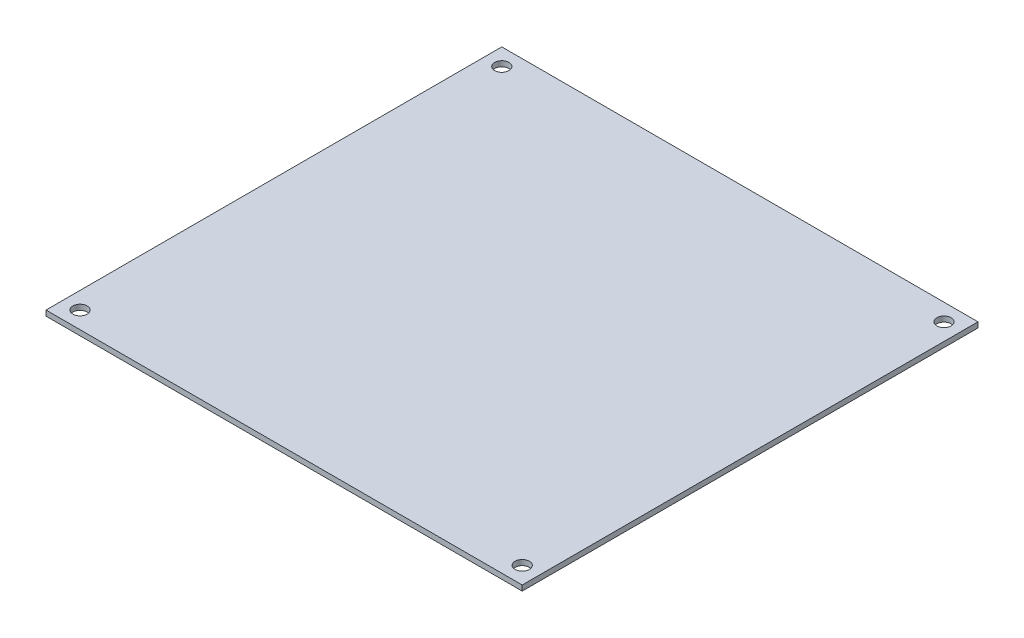
ISO-10303-21;
HEADER;
FILE_DESCRIPTION(('STEP AP214'),'2;1');
FILE_NAME('part.step','',(''),(''),'','','');
FILE_SCHEMA(('AUTOMOTIVE_DESIGN { 1 0 10303 214 1 1 1 1 }'));
ENDSEC;
DATA;
#1=APPLICATION_CONTEXT('core data for automotive mechanical design processes');
#2=APPLICATION_PROTOCOL_DEFINITION('international standard','automotive_design',2000,#1);
#3=PRODUCT_CONTEXT('',#1,'mechanical');
#4=PRODUCT('Part','Part','',(#3));
#5=PRODUCT_RELATED_PRODUCT_CATEGORY('part','',(#4));
#6=PRODUCT_DEFINITION_FORMATION('','',#4);
#7=PRODUCT_DEFINITION_CONTEXT('part definition',#1,'design');
#8=PRODUCT_DEFINITION('design','',#6,#7);
#9=PRODUCT_DEFINITION_SHAPE('','',#8);
#10=(LENGTH_UNIT() NAMED_UNIT(*) SI_UNIT(.MILLI.,.METRE.));
#11=(NAMED_UNIT(*) PLANE_ANGLE_UNIT() SI_UNIT($,.RADIAN.));
#12=(NAMED_UNIT(*) SI_UNIT($,.STERADIAN.) SOLID_ANGLE_UNIT());
#13=UNCERTAINTY_MEASURE_WITH_UNIT(LENGTH_MEASURE(1.E-05),#10,'distance_accuracy_value','');
#14=(GEOMETRIC_REPRESENTATION_CONTEXT(3) GLOBAL_UNCERTAINTY_ASSIGNED_CONTEXT((#13)) GLOBAL_UNIT_ASSIGNED_CONTEXT((#10,
#11,#12)) REPRESENTATION_CONTEXT('',''));
#15=CARTESIAN_POINT('',(0.,0.,0.));
#16=DIRECTION('',(0.,0.,1.));
#17=DIRECTION('',(1.,0.,0.));
#18=AXIS2_PLACEMENT_3D('',#15,#16,#17);
#19=CARTESIAN_POINT('',(0.,1.57,0.));
#20=DIRECTION('',(0.,-1.,0.));
#21=DIRECTION('',(0.,0.,-1.));
#22=AXIS2_PLACEMENT_3D('',#19,#20,#21);
#23=PLANE('',#22);
#24=DIRECTION('',(0.,0.,1.));
#25=VECTOR('',#24,1.);
#26=CARTESIAN_POINT('',(0.,1.57,0.));
#27=LINE('',#26,#25);
#28=CARTESIAN_POINT('',(0.,1.57,-134.));
#29=VERTEX_POINT('',#28);
#30=CARTESIAN_POINT('',(0.,1.57,0.));
#31=VERTEX_POINT('',#30);
#32=EDGE_CURVE('E85',#29,#31,#27,.T.);
#33=ORIENTED_EDGE('',*,*,#32,.T.);
#34=DIRECTION('',(1.,0.,0.));
#35=VECTOR('',#34,1.);
#36=CARTESIAN_POINT('',(0.,1.57,0.));
#37=LINE('',#36,#35);
#38=CARTESIAN_POINT('',(140.,1.57,0.));
#39=VERTEX_POINT('',#38);
#40=EDGE_CURVE('E80',#31,#39,#37,.T.);
#41=ORIENTED_EDGE('',*,*,#40,.T.);
#42=DIRECTION('',(0.,0.,-1.));
#43=VECTOR('',#42,1.);
#44=CARTESIAN_POINT('',(140.,1.57,0.));
#45=LINE('',#44,#43);
#46=CARTESIAN_POINT('',(140.,1.57,-134.));
#47=VERTEX_POINT('',#46);
#48=EDGE_CURVE('E83',#39,#47,#45,.T.);
#49=ORIENTED_EDGE('',*,*,#48,.T.);
#50=DIRECTION('',(-1.,0.,0.));
#51=VECTOR('',#50,1.);
#52=CARTESIAN_POINT('',(0.,1.57,-134.));
#53=LINE('',#52,#51);
#54=EDGE_CURVE('E50',#47,#29,#53,.T.);
#55=ORIENTED_EDGE('',*,*,#54,.T.);
#56=EDGE_LOOP('',(#33,#41,#49,#55));
#57=FACE_BOUND('',#56,.T.);
#58=CARTESIAN_POINT('',(5.00000000000002,1.57,-129.));
#59=DIRECTION('',(0.,1.,0.));
#60=DIRECTION('',(0.,0.,1.));
#61=AXIS2_PLACEMENT_3D('',#58,#59,#60);
#62=CIRCLE('',#61,2.1);
#63=CARTESIAN_POINT('',(5.00000000000002,1.57,-126.9));
#64=VERTEX_POINT('',#63);
#65=EDGE_CURVE('E100',#64,#64,#62,.T.);
#66=ORIENTED_EDGE('',*,*,#65,.F.);
#67=EDGE_LOOP('',(#66));
#68=FACE_BOUND('',#67,.T.);
#69=CARTESIAN_POINT('',(135.,1.57,-129.));
#70=DIRECTION('',(0.,1.,0.));
#71=DIRECTION('',(0.,0.,1.));
#72=AXIS2_PLACEMENT_3D('',#69,#70,#71);
#73=CIRCLE('',#72,2.10000000000002);
#74=CARTESIAN_POINT('',(135.,1.57,-126.9));
#75=VERTEX_POINT('',#74);
#76=EDGE_CURVE('E115',#75,#75,#73,.T.);
#77=ORIENTED_EDGE('',*,*,#76,.F.);
#78=EDGE_LOOP('',(#77));
#79=FACE_BOUND('',#78,.T.);
#80=CARTESIAN_POINT('',(135.,1.57,-5.));
#81=DIRECTION('',(0.,1.,0.));
#82=DIRECTION('',(0.,0.,1.));
#83=AXIS2_PLACEMENT_3D('',#80,#81,#82);
#84=CIRCLE('',#83,2.09999999999999);
#85=CARTESIAN_POINT('',(135.,1.57,-2.90000000000001));
#86=VERTEX_POINT('',#85);
#87=EDGE_CURVE('E121',#86,#86,#84,.T.);
#88=ORIENTED_EDGE('',*,*,#87,.F.);
#89=EDGE_LOOP('',(#88));
#90=FACE_BOUND('',#89,.T.);
#91=CARTESIAN_POINT('',(5.00000000000002,1.57,-4.99999999999999));
#92=DIRECTION('',(0.,1.,0.));
#93=DIRECTION('',(0.,0.,1.));
#94=AXIS2_PLACEMENT_3D('',#91,#92,#93);
#95=CIRCLE('',#94,2.1);
#96=CARTESIAN_POINT('',(5.00000000000002,1.57,-2.89999999999999));
#97=VERTEX_POINT('',#96);
#98=EDGE_CURVE('E127',#97,#97,#95,.T.);
#99=ORIENTED_EDGE('',*,*,#98,.F.);
#100=EDGE_LOOP('',(#99));
#101=FACE_BOUND('',#100,.T.);
#102=ADVANCED_FACE('F33',(#57,#68,#79,#90,#101),#23,.F.);
#103=CARTESIAN_POINT('',(0.,0.,0.));
#104=DIRECTION('',(0.,-1.,0.));
#105=DIRECTION('',(0.,0.,-1.));
#106=AXIS2_PLACEMENT_3D('',#103,#104,#105);
#107=PLANE('',#106);
#108=CARTESIAN_POINT('',(135.,0.,-5.));
#109=DIRECTION('',(0.,1.,0.));
#110=DIRECTION('',(0.,0.,1.));
#111=AXIS2_PLACEMENT_3D('',#108,#109,#110);
#112=CIRCLE('',#111,2.09999999999999);
#113=CARTESIAN_POINT('',(135.,0.,-2.90000000000001));
#114=VERTEX_POINT('',#113);
#115=EDGE_CURVE('E124',#114,#114,#112,.T.);
#116=ORIENTED_EDGE('',*,*,#115,.T.);
#117=EDGE_LOOP('',(#116));
#118=FACE_BOUND('',#117,.T.);
#119=CARTESIAN_POINT('',(5.00000000000002,0.,-129.));
#120=DIRECTION('',(0.,1.,0.));
#121=DIRECTION('',(0.,0.,1.));
#122=AXIS2_PLACEMENT_3D('',#119,#120,#121);
#123=CIRCLE('',#122,2.1);
#124=CARTESIAN_POINT('',(5.00000000000002,0.,-126.9));
#125=VERTEX_POINT('',#124);
#126=EDGE_CURVE('E112',#125,#125,#123,.T.);
#127=ORIENTED_EDGE('',*,*,#126,.T.);
#128=EDGE_LOOP('',(#127));
#129=FACE_BOUND('',#128,.T.);
#130=DIRECTION('',(0.,0.,1.));
#131=VECTOR('',#130,1.);
#132=CARTESIAN_POINT('',(0.,0.,0.));
#133=LINE('',#132,#131);
#134=CARTESIAN_POINT('',(0.,0.,-134.));
#135=VERTEX_POINT('',#134);
#136=CARTESIAN_POINT('',(0.,0.,0.));
#137=VERTEX_POINT('',#136);
#138=EDGE_CURVE('E97',#135,#137,#133,.T.);
#139=ORIENTED_EDGE('',*,*,#138,.F.);
#140=DIRECTION('',(-1.,0.,0.));
#141=VECTOR('',#140,1.);
#142=CARTESIAN_POINT('',(0.,0.,-134.));
#143=LINE('',#142,#141);
#144=CARTESIAN_POINT('',(140.,0.,-134.));
#145=VERTEX_POINT('',#144);
#146=EDGE_CURVE('E73',#145,#135,#143,.T.);
#147=ORIENTED_EDGE('',*,*,#146,.F.);
#148=DIRECTION('',(0.,0.,-1.));
#149=VECTOR('',#148,1.);
#150=CARTESIAN_POINT('',(140.,0.,0.));
#151=LINE('',#150,#149);
#152=CARTESIAN_POINT('',(140.,0.,0.));
#153=VERTEX_POINT('',#152);
#154=EDGE_CURVE('E67',#153,#145,#151,.T.);
#155=ORIENTED_EDGE('',*,*,#154,.F.);
#156=DIRECTION('',(1.,0.,0.));
#157=VECTOR('',#156,1.);
#158=CARTESIAN_POINT('',(0.,0.,0.));
#159=LINE('',#158,#157);
#160=EDGE_CURVE('E89',#137,#153,#159,.T.);
#161=ORIENTED_EDGE('',*,*,#160,.F.);
#162=EDGE_LOOP('',(#139,#147,#155,#161));
#163=FACE_BOUND('',#162,.T.);
#164=CARTESIAN_POINT('',(135.,0.,-129.));
#165=DIRECTION('',(0.,1.,0.));
#166=DIRECTION('',(0.,0.,1.));
#167=AXIS2_PLACEMENT_3D('',#164,#165,#166);
#168=CIRCLE('',#167,2.10000000000002);
#169=CARTESIAN_POINT('',(135.,0.,-126.9));
#170=VERTEX_POINT('',#169);
#171=EDGE_CURVE('E118',#170,#170,#168,.T.);
#172=ORIENTED_EDGE('',*,*,#171,.T.);
#173=EDGE_LOOP('',(#172));
#174=FACE_BOUND('',#173,.T.);
#175=CARTESIAN_POINT('',(5.00000000000002,0.,-4.99999999999999));
#176=DIRECTION('',(0.,1.,0.));
#177=DIRECTION('',(0.,0.,1.));
#178=AXIS2_PLACEMENT_3D('',#175,#176,#177);
#179=CIRCLE('',#178,2.1);
#180=CARTESIAN_POINT('',(5.00000000000002,0.,-2.89999999999999));
#181=VERTEX_POINT('',#180);
#182=EDGE_CURVE('E130',#181,#181,#179,.T.);
#183=ORIENTED_EDGE('',*,*,#182,.T.);
#184=EDGE_LOOP('',(#183));
#185=FACE_BOUND('',#184,.T.);
#186=ADVANCED_FACE('F108',(#118,#129,#163,#174,#185),#107,.T.);
#187=CARTESIAN_POINT('',(0.,1.57,0.));
#188=DIRECTION('',(1.,0.,0.));
#189=DIRECTION('',(0.,0.,-1.));
#190=AXIS2_PLACEMENT_3D('',#187,#188,#189);
#191=PLANE('',#190);
#192=ORIENTED_EDGE('',*,*,#138,.T.);
#193=DIRECTION('',(0.,-1.,0.));
#194=VECTOR('',#193,1.);
#195=CARTESIAN_POINT('',(0.,1.57,0.));
#196=LINE('',#195,#194);
#197=EDGE_CURVE('E11',#31,#137,#196,.T.);
#198=ORIENTED_EDGE('',*,*,#197,.F.);
#199=ORIENTED_EDGE('',*,*,#32,.F.);
#200=DIRECTION('',(0.,-1.,0.));
#201=VECTOR('',#200,1.);
#202=CARTESIAN_POINT('',(0.,1.57,-134.));
#203=LINE('',#202,#201);
#204=EDGE_CURVE('E93',#29,#135,#203,.T.);
#205=ORIENTED_EDGE('',*,*,#204,.T.);
#206=EDGE_LOOP('',(#192,#198,#199,#205));
#207=FACE_BOUND('',#206,.T.);
#208=ADVANCED_FACE('F35',(#207),#191,.F.);
#209=CARTESIAN_POINT('',(0.,1.57,0.));
#210=DIRECTION('',(0.,0.,-1.));
#211=DIRECTION('',(-1.,0.,0.));
#212=AXIS2_PLACEMENT_3D('',#209,#210,#211);
#213=PLANE('',#212);
#214=ORIENTED_EDGE('',*,*,#160,.T.);
#215=DIRECTION('',(0.,-1.,0.));
#216=VECTOR('',#215,1.);
#217=CARTESIAN_POINT('',(140.,1.57,0.));
#218=LINE('',#217,#216);
#219=EDGE_CURVE('E42',#39,#153,#218,.T.);
#220=ORIENTED_EDGE('',*,*,#219,.F.);
#221=ORIENTED_EDGE('',*,*,#40,.F.);
#222=ORIENTED_EDGE('',*,*,#197,.T.);
#223=EDGE_LOOP('',(#214,#220,#221,#222));
#224=FACE_BOUND('',#223,.T.);
#225=ADVANCED_FACE('F88',(#224),#213,.F.);
#226=CARTESIAN_POINT('',(140.,1.57,0.));
#227=DIRECTION('',(-1.,0.,0.));
#228=DIRECTION('',(0.,0.,1.));
#229=AXIS2_PLACEMENT_3D('',#226,#227,#228);
#230=PLANE('',#229);
#231=ORIENTED_EDGE('',*,*,#154,.T.);
#232=DIRECTION('',(0.,-1.,0.));
#233=VECTOR('',#232,1.);
#234=CARTESIAN_POINT('',(140.,1.57,-134.));
#235=LINE('',#234,#233);
#236=EDGE_CURVE('E90',#47,#145,#235,.T.);
#237=ORIENTED_EDGE('',*,*,#236,.F.);
#238=ORIENTED_EDGE('',*,*,#48,.F.);
#239=ORIENTED_EDGE('',*,*,#219,.T.);
#240=EDGE_LOOP('',(#231,#237,#238,#239));
#241=FACE_BOUND('',#240,.T.);
#242=ADVANCED_FACE('F91',(#241),#230,.F.);
#243=CARTESIAN_POINT('',(0.,1.57,-134.));
#244=DIRECTION('',(0.,0.,1.));
#245=DIRECTION('',(1.,0.,0.));
#246=AXIS2_PLACEMENT_3D('',#243,#244,#245);
#247=PLANE('',#246);
#248=ORIENTED_EDGE('',*,*,#146,.T.);
#249=ORIENTED_EDGE('',*,*,#204,.F.);
#250=ORIENTED_EDGE('',*,*,#54,.F.);
#251=ORIENTED_EDGE('',*,*,#236,.T.);
#252=EDGE_LOOP('',(#248,#249,#250,#251));
#253=FACE_BOUND('',#252,.T.);
#254=ADVANCED_FACE('F105',(#253),#247,.F.);
#255=CARTESIAN_POINT('',(5.00000000000002,1.57,-129.));
#256=DIRECTION('',(0.,-1.,0.));
#257=DIRECTION('',(0.,0.,-1.));
#258=AXIS2_PLACEMENT_3D('',#255,#256,#257);
#259=CYLINDRICAL_SURFACE('',#258,2.1);
#260=ORIENTED_EDGE('',*,*,#65,.T.);
#261=EDGE_LOOP('',(#260));
#262=FACE_BOUND('',#261,.T.);
#263=ORIENTED_EDGE('',*,*,#126,.F.);
#264=EDGE_LOOP('',(#263));
#265=FACE_BOUND('',#264,.T.);
#266=ADVANCED_FACE('F147',(#262,#265),#259,.F.);
#267=CARTESIAN_POINT('',(135.,1.57,-129.));
#268=DIRECTION('',(0.,-1.,0.));
#269=DIRECTION('',(0.,0.,-1.));
#270=AXIS2_PLACEMENT_3D('',#267,#268,#269);
#271=CYLINDRICAL_SURFACE('',#270,2.10000000000002);
#272=ORIENTED_EDGE('',*,*,#76,.T.);
#273=EDGE_LOOP('',(#272));
#274=FACE_BOUND('',#273,.T.);
#275=ORIENTED_EDGE('',*,*,#171,.F.);
#276=EDGE_LOOP('',(#275));
#277=FACE_BOUND('',#276,.T.);
#278=ADVANCED_FACE('F193',(#274,#277),#271,.F.);
#279=CARTESIAN_POINT('',(135.,1.57,-5.));
#280=DIRECTION('',(0.,-1.,0.));
#281=DIRECTION('',(0.,0.,-1.));
#282=AXIS2_PLACEMENT_3D('',#279,#280,#281);
#283=CYLINDRICAL_SURFACE('',#282,2.09999999999999);
#284=ORIENTED_EDGE('',*,*,#87,.T.);
#285=EDGE_LOOP('',(#284));
#286=FACE_BOUND('',#285,.T.);
#287=ORIENTED_EDGE('',*,*,#115,.F.);
#288=EDGE_LOOP('',(#287));
#289=FACE_BOUND('',#288,.T.);
#290=ADVANCED_FACE('F201',(#286,#289),#283,.F.);
#291=CARTESIAN_POINT('',(5.00000000000002,1.57,-4.99999999999999));
#292=DIRECTION('',(0.,-1.,0.));
#293=DIRECTION('',(0.,0.,-1.));
#294=AXIS2_PLACEMENT_3D('',#291,#292,#293);
#295=CYLINDRICAL_SURFACE('',#294,2.1);
#296=ORIENTED_EDGE('',*,*,#98,.T.);
#297=EDGE_LOOP('',(#296));
#298=FACE_BOUND('',#297,.T.);
#299=ORIENTED_EDGE('',*,*,#182,.F.);
#300=EDGE_LOOP('',(#299));
#301=FACE_BOUND('',#300,.T.);
#302=ADVANCED_FACE('F136',(#298,#301),#295,.F.);
#303=CLOSED_SHELL('',(#102,#186,#208,#225,#242,#254,#266,#278,#290,#302));
#304=MANIFOLD_SOLID_BREP('B2',#303);
#305=ADVANCED_BREP_SHAPE_REPRESENTATION('',(#18,#304),#14);
#306=SHAPE_DEFINITION_REPRESENTATION(#9,#305);
ENDSEC;
END-ISO-10303-21;
